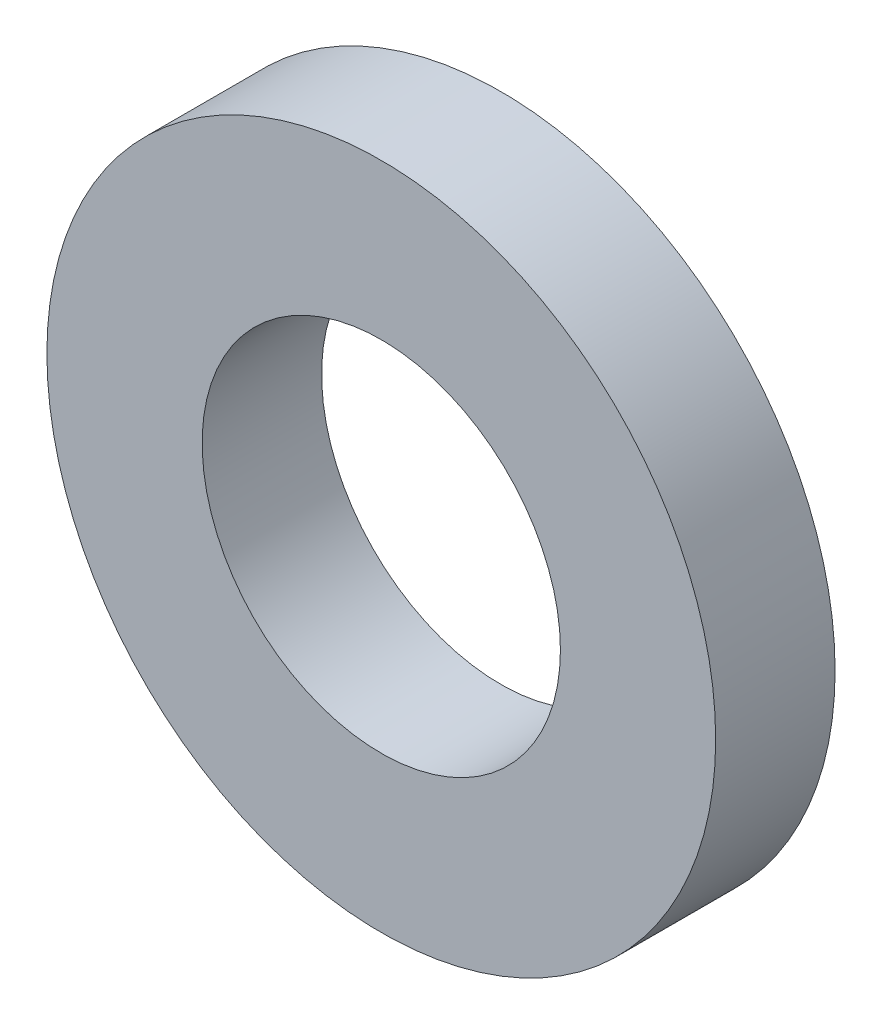
ISO-10303-21;
HEADER;
FILE_DESCRIPTION(('STEP AP214'),'2;1');
FILE_NAME('part.step','',(''),(''),'','','');
FILE_SCHEMA(('AUTOMOTIVE_DESIGN { 1 0 10303 214 1 1 1 1 }'));
ENDSEC;
DATA;
#1=APPLICATION_CONTEXT('core data for automotive mechanical design processes');
#2=APPLICATION_PROTOCOL_DEFINITION('international standard','automotive_design',2000,#1);
#3=PRODUCT_CONTEXT('',#1,'mechanical');
#4=PRODUCT('Part','Part','',(#3));
#5=PRODUCT_RELATED_PRODUCT_CATEGORY('part','',(#4));
#6=PRODUCT_DEFINITION_FORMATION('','',#4);
#7=PRODUCT_DEFINITION_CONTEXT('part definition',#1,'design');
#8=PRODUCT_DEFINITION('design','',#6,#7);
#9=PRODUCT_DEFINITION_SHAPE('','',#8);
#10=(LENGTH_UNIT() NAMED_UNIT(*) SI_UNIT(.MILLI.,.METRE.));
#11=(NAMED_UNIT(*) PLANE_ANGLE_UNIT() SI_UNIT($,.RADIAN.));
#12=(NAMED_UNIT(*) SI_UNIT($,.STERADIAN.) SOLID_ANGLE_UNIT());
#13=UNCERTAINTY_MEASURE_WITH_UNIT(LENGTH_MEASURE(1.E-05),#10,'distance_accuracy_value','');
#14=(GEOMETRIC_REPRESENTATION_CONTEXT(3) GLOBAL_UNCERTAINTY_ASSIGNED_CONTEXT((#13)) GLOBAL_UNIT_ASSIGNED_CONTEXT((#10,
#11,#12)) REPRESENTATION_CONTEXT('',''));
#15=CARTESIAN_POINT('',(0.,0.,0.));
#16=DIRECTION('',(0.,0.,1.));
#17=DIRECTION('',(1.,0.,0.));
#18=AXIS2_PLACEMENT_3D('',#15,#16,#17);
#19=CARTESIAN_POINT('',(0.,0.,5.));
#20=DIRECTION('',(0.,0.,1.));
#21=DIRECTION('',(1.,0.,0.));
#22=AXIS2_PLACEMENT_3D('',#19,#20,#21);
#23=PLANE('',#22);
#24=CARTESIAN_POINT('',(0.,0.,5.));
#25=DIRECTION('',(0.,0.,1.));
#26=DIRECTION('',(1.,0.,0.));
#27=AXIS2_PLACEMENT_3D('',#24,#25,#26);
#28=CIRCLE('',#27,14.);
#29=CARTESIAN_POINT('',(14.,0.,5.));
#30=VERTEX_POINT('',#29);
#31=EDGE_CURVE('E10',#30,#30,#28,.T.);
#32=ORIENTED_EDGE('',*,*,#31,.T.);
#33=EDGE_LOOP('',(#32));
#34=FACE_BOUND('',#33,.T.);
#35=CARTESIAN_POINT('',(0.,0.,5.));
#36=DIRECTION('',(0.,0.,1.));
#37=DIRECTION('',(1.,0.,0.));
#38=AXIS2_PLACEMENT_3D('',#35,#36,#37);
#39=CIRCLE('',#38,7.5);
#40=CARTESIAN_POINT('',(7.5,0.,5.));
#41=VERTEX_POINT('',#40);
#42=EDGE_CURVE('E42',#41,#41,#39,.T.);
#43=ORIENTED_EDGE('',*,*,#42,.F.);
#44=EDGE_LOOP('',(#43));
#45=FACE_BOUND('',#44,.T.);
#46=ADVANCED_FACE('F31',(#34,#45),#23,.T.);
#47=CARTESIAN_POINT('',(0.,0.,0.));
#48=DIRECTION('',(0.,0.,1.));
#49=DIRECTION('',(1.,0.,0.));
#50=AXIS2_PLACEMENT_3D('',#47,#48,#49);
#51=PLANE('',#50);
#52=CARTESIAN_POINT('',(0.,0.,0.));
#53=DIRECTION('',(0.,0.,1.));
#54=DIRECTION('',(1.,0.,0.));
#55=AXIS2_PLACEMENT_3D('',#52,#53,#54);
#56=CIRCLE('',#55,14.);
#57=CARTESIAN_POINT('',(14.,0.,0.));
#58=VERTEX_POINT('',#57);
#59=EDGE_CURVE('E35',#58,#58,#56,.T.);
#60=ORIENTED_EDGE('',*,*,#59,.F.);
#61=EDGE_LOOP('',(#60));
#62=FACE_BOUND('',#61,.T.);
#63=CARTESIAN_POINT('',(0.,0.,0.));
#64=DIRECTION('',(0.,0.,1.));
#65=DIRECTION('',(1.,0.,0.));
#66=AXIS2_PLACEMENT_3D('',#63,#64,#65);
#67=CIRCLE('',#66,7.5);
#68=CARTESIAN_POINT('',(7.5,0.,0.));
#69=VERTEX_POINT('',#68);
#70=EDGE_CURVE('E44',#69,#69,#67,.T.);
#71=ORIENTED_EDGE('',*,*,#70,.T.);
#72=EDGE_LOOP('',(#71));
#73=FACE_BOUND('',#72,.T.);
#74=ADVANCED_FACE('F54',(#62,#73),#51,.F.);
#75=CARTESIAN_POINT('',(0.,0.,5.));
#76=DIRECTION('',(0.,0.,-1.));
#77=DIRECTION('',(-1.,0.,0.));
#78=AXIS2_PLACEMENT_3D('',#75,#76,#77);
#79=CYLINDRICAL_SURFACE('',#78,14.);
#80=ORIENTED_EDGE('',*,*,#31,.F.);
#81=EDGE_LOOP('',(#80));
#82=FACE_BOUND('',#81,.T.);
#83=ORIENTED_EDGE('',*,*,#59,.T.);
#84=EDGE_LOOP('',(#83));
#85=FACE_BOUND('',#84,.T.);
#86=ADVANCED_FACE('F33',(#82,#85),#79,.T.);
#87=CARTESIAN_POINT('',(0.,0.,5.));
#88=DIRECTION('',(0.,0.,-1.));
#89=DIRECTION('',(-1.,0.,0.));
#90=AXIS2_PLACEMENT_3D('',#87,#88,#89);
#91=CYLINDRICAL_SURFACE('',#90,7.5);
#92=ORIENTED_EDGE('',*,*,#42,.T.);
#93=EDGE_LOOP('',(#92));
#94=FACE_BOUND('',#93,.T.);
#95=ORIENTED_EDGE('',*,*,#70,.F.);
#96=EDGE_LOOP('',(#95));
#97=FACE_BOUND('',#96,.T.);
#98=ADVANCED_FACE('F50',(#94,#97),#91,.F.);
#99=CLOSED_SHELL('',(#46,#74,#86,#98));
#100=MANIFOLD_SOLID_BREP('B2',#99);
#101=ADVANCED_BREP_SHAPE_REPRESENTATION('',(#18,#100),#14);
#102=SHAPE_DEFINITION_REPRESENTATION(#9,#101);
ENDSEC;
END-ISO-10303-21;
